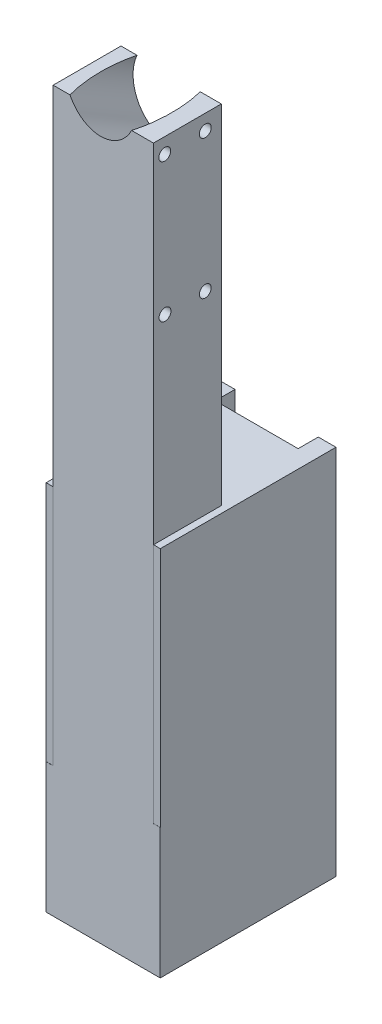
ISO-10303-21;
HEADER;
FILE_DESCRIPTION(('STEP AP214'),'2;1');
FILE_NAME('part.step','',(''),(''),'','','');
FILE_SCHEMA(('AUTOMOTIVE_DESIGN { 1 0 10303 214 1 1 1 1 }'));
ENDSEC;
DATA;
#1=APPLICATION_CONTEXT('core data for automotive mechanical design processes');
#2=APPLICATION_PROTOCOL_DEFINITION('international standard','automotive_design',2000,#1);
#3=PRODUCT_CONTEXT('',#1,'mechanical');
#4=PRODUCT('Part','Part','',(#3));
#5=PRODUCT_RELATED_PRODUCT_CATEGORY('part','',(#4));
#6=PRODUCT_DEFINITION_FORMATION('','',#4);
#7=PRODUCT_DEFINITION_CONTEXT('part definition',#1,'design');
#8=PRODUCT_DEFINITION('design','',#6,#7);
#9=PRODUCT_DEFINITION_SHAPE('','',#8);
#10=(LENGTH_UNIT() NAMED_UNIT(*) SI_UNIT(.MILLI.,.METRE.));
#11=(NAMED_UNIT(*) PLANE_ANGLE_UNIT() SI_UNIT($,.RADIAN.));
#12=(NAMED_UNIT(*) SI_UNIT($,.STERADIAN.) SOLID_ANGLE_UNIT());
#13=UNCERTAINTY_MEASURE_WITH_UNIT(LENGTH_MEASURE(1.E-05),#10,'distance_accuracy_value','');
#14=(GEOMETRIC_REPRESENTATION_CONTEXT(3) GLOBAL_UNCERTAINTY_ASSIGNED_CONTEXT((#13)) GLOBAL_UNIT_ASSIGNED_CONTEXT((#10,
#11,#12)) REPRESENTATION_CONTEXT('',''));
#15=CARTESIAN_POINT('',(0.,0.,0.));
#16=DIRECTION('',(0.,0.,1.));
#17=DIRECTION('',(1.,0.,0.));
#18=AXIS2_PLACEMENT_3D('',#15,#16,#17);
#19=CARTESIAN_POINT('',(4691.55444195582,-4349.73956554871,53.2520183883639));
#20=DIRECTION('',(-1.,0.,0.));
#21=DIRECTION('',(0.,1.,0.));
#22=AXIS2_PLACEMENT_3D('',#19,#20,#21);
#23=PLANE('',#22);
#24=CARTESIAN_POINT('',(4691.55444195582,-4349.73956554871,53.2520183883639));
#25=DIRECTION('',(1.,0.,0.));
#26=DIRECTION('',(0.,1.,0.));
#27=AXIS2_PLACEMENT_3D('',#24,#25,#26);
#28=CIRCLE('',#27,1.50000000000031);
#29=CARTESIAN_POINT('',(4691.55444195582,-4348.23956554871,53.2520183883639));
#30=VERTEX_POINT('',#29);
#31=EDGE_CURVE('E277',#30,#30,#28,.T.);
#32=ORIENTED_EDGE('',*,*,#31,.F.);
#33=EDGE_LOOP('',(#32));
#34=FACE_BOUND('',#33,.T.);
#35=ADVANCED_FACE('F35',(#34),#23,.T.);
#36=CARTESIAN_POINT('',(4691.55444195582,-4349.73956554871,43.0468273602777));
#37=DIRECTION('',(-1.,0.,0.));
#38=DIRECTION('',(0.,1.,0.));
#39=AXIS2_PLACEMENT_3D('',#36,#37,#38);
#40=PLANE('',#39);
#41=CARTESIAN_POINT('',(4691.55444195582,-4349.73956554871,43.0468273602777));
#42=DIRECTION('',(1.,0.,0.));
#43=DIRECTION('',(0.,1.,0.));
#44=AXIS2_PLACEMENT_3D('',#41,#42,#43);
#45=CIRCLE('',#44,1.50000000000004);
#46=CARTESIAN_POINT('',(4691.55444195582,-4348.23956554871,43.0468273602777));
#47=VERTEX_POINT('',#46);
#48=EDGE_CURVE('E276',#47,#47,#45,.T.);
#49=ORIENTED_EDGE('',*,*,#48,.F.);
#50=EDGE_LOOP('',(#49));
#51=FACE_BOUND('',#50,.T.);
#52=ADVANCED_FACE('F688',(#51),#40,.T.);
#53=CARTESIAN_POINT('',(4696.55444195582,-4384.90256348358,53.2520183883639));
#54=DIRECTION('',(-1.,0.,0.));
#55=DIRECTION('',(0.,1.,0.));
#56=AXIS2_PLACEMENT_3D('',#53,#54,#55);
#57=PLANE('',#56);
#58=CARTESIAN_POINT('',(4696.55444195582,-4384.90256348358,53.2520183883639));
#59=DIRECTION('',(1.,0.,0.));
#60=DIRECTION('',(0.,1.,0.));
#61=AXIS2_PLACEMENT_3D('',#58,#59,#60);
#62=CIRCLE('',#61,1.49999999999993);
#63=CARTESIAN_POINT('',(4696.55444195582,-4383.40256348358,53.2520183883639));
#64=VERTEX_POINT('',#63);
#65=EDGE_CURVE('E297',#64,#64,#62,.T.);
#66=ORIENTED_EDGE('',*,*,#65,.F.);
#67=EDGE_LOOP('',(#66));
#68=FACE_BOUND('',#67,.T.);
#69=ADVANCED_FACE('F693',(#68),#57,.T.);
#70=CARTESIAN_POINT('',(4696.55444195582,-4384.90256348358,43.0468273602777));
#71=DIRECTION('',(-1.,0.,0.));
#72=DIRECTION('',(0.,1.,0.));
#73=AXIS2_PLACEMENT_3D('',#70,#71,#72);
#74=PLANE('',#73);
#75=CARTESIAN_POINT('',(4696.55444195582,-4384.90256348358,43.0468273602777));
#76=DIRECTION('',(1.,0.,0.));
#77=DIRECTION('',(0.,1.,0.));
#78=AXIS2_PLACEMENT_3D('',#75,#76,#77);
#79=CIRCLE('',#78,1.50000000000008);
#80=CARTESIAN_POINT('',(4696.55444195582,-4383.40256348358,43.0468273602777));
#81=VERTEX_POINT('',#80);
#82=EDGE_CURVE('E296',#81,#81,#79,.T.);
#83=ORIENTED_EDGE('',*,*,#82,.F.);
#84=EDGE_LOOP('',(#83));
#85=FACE_BOUND('',#84,.T.);
#86=ADVANCED_FACE('F715',(#85),#74,.T.);
#87=CARTESIAN_POINT('',(4710.95444195582,-4349.73956554871,53.3144563773744));
#88=DIRECTION('',(1.,0.,0.));
#89=DIRECTION('',(0.,-1.,0.));
#90=AXIS2_PLACEMENT_3D('',#87,#88,#89);
#91=PLANE('',#90);
#92=CARTESIAN_POINT('',(4710.95444195582,-4349.73956554871,53.3144563773744));
#93=DIRECTION('',(-1.,0.,0.));
#94=DIRECTION('',(0.,-1.,0.));
#95=AXIS2_PLACEMENT_3D('',#92,#93,#94);
#96=CIRCLE('',#95,1.49999999999987);
#97=CARTESIAN_POINT('',(4710.95444195582,-4351.23956554871,53.3144563773744));
#98=VERTEX_POINT('',#97);
#99=EDGE_CURVE('E283',#98,#98,#96,.T.);
#100=ORIENTED_EDGE('',*,*,#99,.F.);
#101=EDGE_LOOP('',(#100));
#102=FACE_BOUND('',#101,.T.);
#103=ADVANCED_FACE('F709',(#102),#91,.T.);
#104=CARTESIAN_POINT('',(4710.95444195582,-4349.73956554871,43.0468273602777));
#105=DIRECTION('',(1.,0.,0.));
#106=DIRECTION('',(0.,-1.,0.));
#107=AXIS2_PLACEMENT_3D('',#104,#105,#106);
#108=PLANE('',#107);
#109=CARTESIAN_POINT('',(4710.95444195582,-4349.73956554871,43.0468273602777));
#110=DIRECTION('',(-1.,0.,0.));
#111=DIRECTION('',(0.,-1.,0.));
#112=AXIS2_PLACEMENT_3D('',#109,#110,#111);
#113=CIRCLE('',#112,1.50000000000009);
#114=CARTESIAN_POINT('',(4710.95444195582,-4351.23956554871,43.0468273602777));
#115=VERTEX_POINT('',#114);
#116=EDGE_CURVE('E287',#115,#115,#113,.T.);
#117=ORIENTED_EDGE('',*,*,#116,.F.);
#118=EDGE_LOOP('',(#117));
#119=FACE_BOUND('',#118,.T.);
#120=ADVANCED_FACE('F714',(#119),#108,.T.);
#121=CARTESIAN_POINT('',(4705.95444195582,-4384.90256348358,43.0468273602777));
#122=DIRECTION('',(1.,0.,0.));
#123=DIRECTION('',(0.,-1.,0.));
#124=AXIS2_PLACEMENT_3D('',#121,#122,#123);
#125=PLANE('',#124);
#126=CARTESIAN_POINT('',(4705.95444195582,-4384.90256348358,43.0468273602777));
#127=DIRECTION('',(-1.,0.,0.));
#128=DIRECTION('',(0.,-1.,0.));
#129=AXIS2_PLACEMENT_3D('',#126,#127,#128);
#130=CIRCLE('',#129,1.50000000000002);
#131=CARTESIAN_POINT('',(4705.95444195582,-4386.40256348358,43.0468273602777));
#132=VERTEX_POINT('',#131);
#133=EDGE_CURVE('E303',#132,#132,#130,.T.);
#134=ORIENTED_EDGE('',*,*,#133,.F.);
#135=EDGE_LOOP('',(#134));
#136=FACE_BOUND('',#135,.T.);
#137=ADVANCED_FACE('F736',(#136),#125,.T.);
#138=CARTESIAN_POINT('',(4705.95444195582,-4384.90256348358,53.2520183883639));
#139=DIRECTION('',(1.,0.,0.));
#140=DIRECTION('',(0.,-1.,0.));
#141=AXIS2_PLACEMENT_3D('',#138,#139,#140);
#142=PLANE('',#141);
#143=CARTESIAN_POINT('',(4705.95444195582,-4384.90256348358,53.2520183883639));
#144=DIRECTION('',(-1.,0.,0.));
#145=DIRECTION('',(0.,-1.,0.));
#146=AXIS2_PLACEMENT_3D('',#143,#144,#145);
#147=CIRCLE('',#146,1.49999999999989);
#148=CARTESIAN_POINT('',(4705.95444195582,-4386.40256348358,53.2520183883639));
#149=VERTEX_POINT('',#148);
#150=EDGE_CURVE('E307',#149,#149,#147,.T.);
#151=ORIENTED_EDGE('',*,*,#150,.F.);
#152=EDGE_LOOP('',(#151));
#153=FACE_BOUND('',#152,.T.);
#154=ADVANCED_FACE('F547',(#153),#142,.T.);
#155=CARTESIAN_POINT('',(4701.20818872367,-4491.71721595928,21.7710006429915));
#156=DIRECTION('',(0.,0.,-1.));
#157=DIRECTION('',(0.,1.,0.));
#158=AXIS2_PLACEMENT_3D('',#155,#156,#157);
#159=PLANE('',#158);
#160=CARTESIAN_POINT('',(4701.20818872367,-4491.71721595928,21.7710006429915));
#161=DIRECTION('',(0.,0.,-1.));
#162=DIRECTION('',(0.,1.,0.));
#163=AXIS2_PLACEMENT_3D('',#160,#161,#162);
#164=CIRCLE('',#163,1.40000000000023);
#165=CARTESIAN_POINT('',(4701.20818872367,-4490.31721595928,21.7710006429915));
#166=VERTEX_POINT('',#165);
#167=EDGE_CURVE('E347',#166,#166,#164,.T.);
#168=ORIENTED_EDGE('',*,*,#167,.T.);
#169=EDGE_LOOP('',(#168));
#170=FACE_BOUND('',#169,.T.);
#171=ADVANCED_FACE('F539',(#170),#159,.T.);
#172=CARTESIAN_POINT('',(4701.20818872367,-4445.91721595928,21.7710006429915));
#173=DIRECTION('',(0.,0.,-1.));
#174=DIRECTION('',(0.,1.,0.));
#175=AXIS2_PLACEMENT_3D('',#172,#173,#174);
#176=PLANE('',#175);
#177=CARTESIAN_POINT('',(4701.20818872367,-4445.91721595928,21.7710006429915));
#178=DIRECTION('',(0.,0.,-1.));
#179=DIRECTION('',(0.,1.,0.));
#180=AXIS2_PLACEMENT_3D('',#177,#178,#179);
#181=CIRCLE('',#180,1.40000000000023);
#182=CARTESIAN_POINT('',(4701.20818872367,-4444.51721595928,21.7710006429915));
#183=VERTEX_POINT('',#182);
#184=EDGE_CURVE('E341',#183,#183,#181,.T.);
#185=ORIENTED_EDGE('',*,*,#184,.T.);
#186=EDGE_LOOP('',(#185));
#187=FACE_BOUND('',#186,.T.);
#188=ADVANCED_FACE('F535',(#187),#176,.T.);
#189=CARTESIAN_POINT('',(4691.55444195582,-4349.73956554871,53.2520183883639));
#190=DIRECTION('',(-1.,0.,0.));
#191=DIRECTION('',(0.,-1.,0.));
#192=AXIS2_PLACEMENT_3D('',#189,#190,#191);
#193=CYLINDRICAL_SURFACE('',#192,1.50000000000031);
#194=ORIENTED_EDGE('',*,*,#31,.T.);
#195=EDGE_LOOP('',(#194));
#196=FACE_BOUND('',#195,.T.);
#197=CARTESIAN_POINT('',(4689.15444195568,-4349.73956554871,53.2520183883639));
#198=DIRECTION('',(1.,0.,0.));
#199=DIRECTION('',(0.,1.,0.));
#200=AXIS2_PLACEMENT_3D('',#197,#198,#199);
#201=CIRCLE('',#200,1.50000000000031);
#202=CARTESIAN_POINT('',(4689.15444195568,-4348.23956554871,53.2520183883639));
#203=VERTEX_POINT('',#202);
#204=EDGE_CURVE('E290',#203,#203,#201,.F.);
#205=ORIENTED_EDGE('',*,*,#204,.T.);
#206=EDGE_LOOP('',(#205));
#207=FACE_BOUND('',#206,.T.);
#208=ADVANCED_FACE('F538',(#196,#207),#193,.F.);
#209=CARTESIAN_POINT('',(4691.55444195582,-4349.73956554871,43.0468273602777));
#210=DIRECTION('',(-1.,0.,0.));
#211=DIRECTION('',(0.,-1.,0.));
#212=AXIS2_PLACEMENT_3D('',#209,#210,#211);
#213=CYLINDRICAL_SURFACE('',#212,1.50000000000004);
#214=ORIENTED_EDGE('',*,*,#48,.T.);
#215=EDGE_LOOP('',(#214));
#216=FACE_BOUND('',#215,.T.);
#217=CARTESIAN_POINT('',(4689.15444195568,-4349.73956554871,43.0468273602777));
#218=DIRECTION('',(1.,0.,0.));
#219=DIRECTION('',(0.,1.,0.));
#220=AXIS2_PLACEMENT_3D('',#217,#218,#219);
#221=CIRCLE('',#220,1.50000000000004);
#222=CARTESIAN_POINT('',(4689.15444195568,-4348.23956554871,43.0468273602777));
#223=VERTEX_POINT('',#222);
#224=EDGE_CURVE('E280',#223,#223,#221,.F.);
#225=ORIENTED_EDGE('',*,*,#224,.T.);
#226=EDGE_LOOP('',(#225));
#227=FACE_BOUND('',#226,.T.);
#228=ADVANCED_FACE('F681',(#216,#227),#213,.F.);
#229=CARTESIAN_POINT('',(4673.55444195582,-4384.90256348358,53.2520183883639));
#230=DIRECTION('',(1.,0.,0.));
#231=DIRECTION('',(0.,1.,0.));
#232=AXIS2_PLACEMENT_3D('',#229,#230,#231);
#233=CYLINDRICAL_SURFACE('',#232,1.49999999999993);
#234=ORIENTED_EDGE('',*,*,#65,.T.);
#235=EDGE_LOOP('',(#234));
#236=FACE_BOUND('',#235,.T.);
#237=CARTESIAN_POINT('',(4689.15444195568,-4384.90256348358,53.2520183883639));
#238=DIRECTION('',(1.,0.,0.));
#239=DIRECTION('',(0.,1.,0.));
#240=AXIS2_PLACEMENT_3D('',#237,#238,#239);
#241=CIRCLE('',#240,1.49999999999993);
#242=CARTESIAN_POINT('',(4689.15444195568,-4383.40256348358,53.2520183883639));
#243=VERTEX_POINT('',#242);
#244=EDGE_CURVE('E310',#243,#243,#241,.T.);
#245=ORIENTED_EDGE('',*,*,#244,.F.);
#246=EDGE_LOOP('',(#245));
#247=FACE_BOUND('',#246,.T.);
#248=ADVANCED_FACE('F703',(#236,#247),#233,.F.);
#249=CARTESIAN_POINT('',(4673.55444195582,-4384.90256348358,43.0468273602777));
#250=DIRECTION('',(1.,0.,0.));
#251=DIRECTION('',(0.,1.,0.));
#252=AXIS2_PLACEMENT_3D('',#249,#250,#251);
#253=CYLINDRICAL_SURFACE('',#252,1.50000000000008);
#254=ORIENTED_EDGE('',*,*,#82,.T.);
#255=EDGE_LOOP('',(#254));
#256=FACE_BOUND('',#255,.T.);
#257=CARTESIAN_POINT('',(4689.15444195568,-4384.90256348358,43.0468273602777));
#258=DIRECTION('',(1.,0.,0.));
#259=DIRECTION('',(0.,1.,0.));
#260=AXIS2_PLACEMENT_3D('',#257,#258,#259);
#261=CIRCLE('',#260,1.50000000000008);
#262=CARTESIAN_POINT('',(4689.15444195568,-4383.40256348358,43.0468273602777));
#263=VERTEX_POINT('',#262);
#264=EDGE_CURVE('E300',#263,#263,#261,.T.);
#265=ORIENTED_EDGE('',*,*,#264,.F.);
#266=EDGE_LOOP('',(#265));
#267=FACE_BOUND('',#266,.T.);
#268=ADVANCED_FACE('F534',(#256,#267),#253,.F.);
#269=CARTESIAN_POINT('',(4714.55444195569,-4315.19321890237,39.0000000000001));
#270=DIRECTION('',(0.,0.,1.));
#271=DIRECTION('',(0.,-1.,0.));
#272=AXIS2_PLACEMENT_3D('',#269,#270,#271);
#273=PLANE('',#272);
#274=CARTESIAN_POINT('',(4701.21390972028,-4350.59250283977,39.0000000000001));
#275=DIRECTION('',(0.,0.,1.));
#276=DIRECTION('',(0.,1.,0.));
#277=AXIS2_PLACEMENT_3D('',#274,#275,#276);
#278=ELLIPSE('',#277,10.3923048454137,9.00000000000035);
#279=CARTESIAN_POINT('',(4709.22570229872,-4345.85806451614,39.0000000000001));
#280=VERTEX_POINT('',#279);
#281=CARTESIAN_POINT('',(4693.20211714185,-4345.85806451614,39.0000000000001));
#282=VERTEX_POINT('',#281);
#283=EDGE_CURVE('E291',#280,#282,#278,.F.);
#284=ORIENTED_EDGE('',*,*,#283,.F.);
#285=DIRECTION('',(1.,0.,0.));
#286=VECTOR('',#285,1.);
#287=CARTESIAN_POINT('',(4714.55444195569,-4345.85806451614,39.0000000000001));
#288=LINE('',#287,#286);
#289=CARTESIAN_POINT('',(4714.55444195569,-4345.85806451614,39.));
#290=VERTEX_POINT('',#289);
#291=EDGE_CURVE('E318',#280,#290,#288,.T.);
#292=ORIENTED_EDGE('',*,*,#291,.T.);
#293=DIRECTION('',(0.,-1.,0.));
#294=VECTOR('',#293,1.);
#295=CARTESIAN_POINT('',(4714.55444195569,-4315.19321890237,39.0000000000001));
#296=LINE('',#295,#294);
#297=CARTESIAN_POINT('',(4714.55444195569,-4433.96840812318,39.));
#298=VERTEX_POINT('',#297);
#299=EDGE_CURVE('E323',#290,#298,#296,.T.);
#300=ORIENTED_EDGE('',*,*,#299,.T.);
#301=DIRECTION('',(1.,0.,0.));
#302=VECTOR('',#301,1.);
#303=CARTESIAN_POINT('',(0.,-4433.96840812318,39.));
#304=LINE('',#303,#302);
#305=CARTESIAN_POINT('',(4689.15444195568,-4433.96840812318,39.));
#306=VERTEX_POINT('',#305);
#307=EDGE_CURVE('E400',#306,#298,#304,.T.);
#308=ORIENTED_EDGE('',*,*,#307,.F.);
#309=DIRECTION('',(0.,-1.,0.));
#310=VECTOR('',#309,1.);
#311=CARTESIAN_POINT('',(4689.15444195568,-4315.19321890237,39.0000000000001));
#312=LINE('',#311,#310);
#313=CARTESIAN_POINT('',(4689.15444195568,-4345.85806451614,39.));
#314=VERTEX_POINT('',#313);
#315=EDGE_CURVE('E331',#314,#306,#312,.T.);
#316=ORIENTED_EDGE('',*,*,#315,.F.);
#317=EDGE_CURVE('E319',#314,#282,#288,.T.);
#318=ORIENTED_EDGE('',*,*,#317,.T.);
#319=EDGE_LOOP('',(#284,#292,#300,#308,#316,#318));
#320=FACE_BOUND('',#319,.T.);
#321=ADVANCED_FACE('F439',(#320),#273,.F.);
#322=CARTESIAN_POINT('',(4716.95444195582,-4349.73956554871,53.3144563773744));
#323=DIRECTION('',(-1.,0.,0.));
#324=DIRECTION('',(0.,-1.,0.));
#325=AXIS2_PLACEMENT_3D('',#322,#323,#324);
#326=CYLINDRICAL_SURFACE('',#325,1.49999999999987);
#327=ORIENTED_EDGE('',*,*,#99,.T.);
#328=EDGE_LOOP('',(#327));
#329=FACE_BOUND('',#328,.T.);
#330=CARTESIAN_POINT('',(4714.55444195569,-4349.73956554871,53.3144563773744));
#331=DIRECTION('',(-1.,0.,0.));
#332=DIRECTION('',(0.,-1.,0.));
#333=AXIS2_PLACEMENT_3D('',#330,#331,#332);
#334=CIRCLE('',#333,1.49999999999987);
#335=CARTESIAN_POINT('',(4714.55444195569,-4351.23956554871,53.3144563773744));
#336=VERTEX_POINT('',#335);
#337=EDGE_CURVE('E294',#336,#336,#334,.T.);
#338=ORIENTED_EDGE('',*,*,#337,.F.);
#339=EDGE_LOOP('',(#338));
#340=FACE_BOUND('',#339,.T.);
#341=ADVANCED_FACE('F533',(#329,#340),#326,.F.);
#342=CARTESIAN_POINT('',(4716.95444195582,-4349.73956554871,43.0468273602777));
#343=DIRECTION('',(-1.,0.,0.));
#344=DIRECTION('',(0.,-1.,0.));
#345=AXIS2_PLACEMENT_3D('',#342,#343,#344);
#346=CYLINDRICAL_SURFACE('',#345,1.50000000000009);
#347=ORIENTED_EDGE('',*,*,#116,.T.);
#348=EDGE_LOOP('',(#347));
#349=FACE_BOUND('',#348,.T.);
#350=CARTESIAN_POINT('',(4714.55444195569,-4349.73956554871,43.0468273602777));
#351=DIRECTION('',(-1.,0.,0.));
#352=DIRECTION('',(0.,-1.,0.));
#353=AXIS2_PLACEMENT_3D('',#350,#351,#352);
#354=CIRCLE('',#353,1.50000000000009);
#355=CARTESIAN_POINT('',(4714.55444195569,-4351.23956554871,43.0468273602777));
#356=VERTEX_POINT('',#355);
#357=EDGE_CURVE('E286',#356,#356,#354,.T.);
#358=ORIENTED_EDGE('',*,*,#357,.F.);
#359=EDGE_LOOP('',(#358));
#360=FACE_BOUND('',#359,.T.);
#361=ADVANCED_FACE('F726',(#349,#360),#346,.F.);
#362=CARTESIAN_POINT('',(4731.64888795786,-4384.90256348358,43.0468273602777));
#363=DIRECTION('',(-1.,0.,0.));
#364=DIRECTION('',(0.,-1.,0.));
#365=AXIS2_PLACEMENT_3D('',#362,#363,#364);
#366=CYLINDRICAL_SURFACE('',#365,1.50000000000002);
#367=ORIENTED_EDGE('',*,*,#133,.T.);
#368=EDGE_LOOP('',(#367));
#369=FACE_BOUND('',#368,.T.);
#370=CARTESIAN_POINT('',(4714.55444195569,-4384.90256348358,43.0468273602777));
#371=DIRECTION('',(-1.,0.,0.));
#372=DIRECTION('',(0.,-1.,0.));
#373=AXIS2_PLACEMENT_3D('',#370,#371,#372);
#374=CIRCLE('',#373,1.50000000000002);
#375=CARTESIAN_POINT('',(4714.55444195569,-4386.40256348358,43.0468273602777));
#376=VERTEX_POINT('',#375);
#377=EDGE_CURVE('E326',#376,#376,#374,.T.);
#378=ORIENTED_EDGE('',*,*,#377,.F.);
#379=EDGE_LOOP('',(#378));
#380=FACE_BOUND('',#379,.T.);
#381=ADVANCED_FACE('F745',(#369,#380),#366,.F.);
#382=CARTESIAN_POINT('',(4731.64888795786,-4384.90256348358,53.2520183883639));
#383=DIRECTION('',(-1.,0.,0.));
#384=DIRECTION('',(0.,-1.,0.));
#385=AXIS2_PLACEMENT_3D('',#382,#383,#384);
#386=CYLINDRICAL_SURFACE('',#385,1.49999999999989);
#387=ORIENTED_EDGE('',*,*,#150,.T.);
#388=EDGE_LOOP('',(#387));
#389=FACE_BOUND('',#388,.T.);
#390=CARTESIAN_POINT('',(4714.55444195569,-4384.90256348358,53.2520183883639));
#391=DIRECTION('',(-1.,0.,0.));
#392=DIRECTION('',(0.,-1.,0.));
#393=AXIS2_PLACEMENT_3D('',#390,#391,#392);
#394=CIRCLE('',#393,1.49999999999989);
#395=CARTESIAN_POINT('',(4714.55444195569,-4386.40256348358,53.2520183883639));
#396=VERTEX_POINT('',#395);
#397=EDGE_CURVE('E306',#396,#396,#394,.T.);
#398=ORIENTED_EDGE('',*,*,#397,.F.);
#399=EDGE_LOOP('',(#398));
#400=FACE_BOUND('',#399,.T.);
#401=ADVANCED_FACE('F556',(#389,#400),#386,.F.);
#402=CARTESIAN_POINT('',(4709.80818871422,-4433.96840812318,56.1600064391854));
#403=DIRECTION('',(0.,0.,-1.));
#404=DIRECTION('',(0.,1.,0.));
#405=AXIS2_PLACEMENT_3D('',#402,#403,#404);
#406=PLANE('',#405);
#407=DIRECTION('',(1.,0.,0.));
#408=VECTOR('',#407,1.);
#409=CARTESIAN_POINT('',(4687.34687520891,-4495.12840812318,56.1600064391854));
#410=LINE('',#409,#408);
#411=CARTESIAN_POINT('',(4714.55444195569,-4495.12840812318,56.1600064391853));
#412=VERTEX_POINT('',#411);
#413=CARTESIAN_POINT('',(4716.26950221952,-4495.12840812318,56.1600064391853));
#414=VERTEX_POINT('',#413);
#415=EDGE_CURVE('E252',#412,#414,#410,.T.);
#416=ORIENTED_EDGE('',*,*,#415,.T.);
#417=DIRECTION('',(0.,-1.,0.));
#418=VECTOR('',#417,1.);
#419=CARTESIAN_POINT('',(4716.26950221952,-4433.96840812318,56.1600064391854));
#420=LINE('',#419,#418);
#421=CARTESIAN_POINT('',(4716.26950221952,-4433.96840812318,56.1600064391854));
#422=VERTEX_POINT('',#421);
#423=EDGE_CURVE('E397',#422,#414,#420,.T.);
#424=ORIENTED_EDGE('',*,*,#423,.F.);
#425=DIRECTION('',(1.,0.,0.));
#426=VECTOR('',#425,1.);
#427=CARTESIAN_POINT('',(4709.80818871422,-4433.96840812318,56.1600064391854));
#428=LINE('',#427,#426);
#429=CARTESIAN_POINT('',(4714.55444195569,-4433.96840812318,56.1600064391854));
#430=VERTEX_POINT('',#429);
#431=EDGE_CURVE('E357',#430,#422,#428,.T.);
#432=ORIENTED_EDGE('',*,*,#431,.F.);
#433=DIRECTION('',(0.,1.,0.));
#434=VECTOR('',#433,1.);
#435=CARTESIAN_POINT('',(4714.55444195569,-4433.96840812318,56.1600064391854));
#436=LINE('',#435,#434);
#437=EDGE_CURVE('E338',#412,#430,#436,.T.);
#438=ORIENTED_EDGE('',*,*,#437,.F.);
#439=EDGE_LOOP('',(#416,#424,#432,#438));
#440=FACE_BOUND('',#439,.T.);
#441=ADVANCED_FACE('F477',(#440),#406,.F.);
#442=CARTESIAN_POINT('',(4709.80818871422,-4433.96840812318,11.6703669037885));
#443=DIRECTION('',(0.,0.,1.));
#444=DIRECTION('',(0.,-1.,0.));
#445=AXIS2_PLACEMENT_3D('',#442,#443,#444);
#446=PLANE('',#445);
#447=DIRECTION('',(0.,-1.,0.));
#448=VECTOR('',#447,1.);
#449=CARTESIAN_POINT('',(4709.80818871422,-4433.96840812318,11.6703669037885));
#450=LINE('',#449,#448);
#451=CARTESIAN_POINT('',(4709.80818871422,-4505.75880094356,11.6703669037885));
#452=VERTEX_POINT('',#451);
#453=CARTESIAN_POINT('',(4709.80818871422,-4525.12840812318,11.6703669037885));
#454=VERTEX_POINT('',#453);
#455=EDGE_CURVE('E393',#452,#454,#450,.T.);
#456=ORIENTED_EDGE('',*,*,#455,.F.);
#457=DIRECTION('',(-1.,0.,0.));
#458=VECTOR('',#457,1.);
#459=CARTESIAN_POINT('',(4711.78575008067,-4505.75880094356,11.6703669037885));
#460=LINE('',#459,#458);
#461=CARTESIAN_POINT('',(4711.78575008067,-4505.75880094356,11.6703669037885));
#462=VERTEX_POINT('',#461);
#463=EDGE_CURVE('E50',#462,#452,#460,.T.);
#464=ORIENTED_EDGE('',*,*,#463,.F.);
#465=DIRECTION('',(0.,-1.,0.));
#466=VECTOR('',#465,1.);
#467=CARTESIAN_POINT('',(4711.78575008067,-4433.96840812318,11.6703669037885));
#468=LINE('',#467,#466);
#469=CARTESIAN_POINT('',(4711.78575008067,-4433.96840812318,11.6703669037885));
#470=VERTEX_POINT('',#469);
#471=EDGE_CURVE('E220',#470,#462,#468,.T.);
#472=ORIENTED_EDGE('',*,*,#471,.F.);
#473=DIRECTION('',(-1.,0.,0.));
#474=VECTOR('',#473,1.);
#475=CARTESIAN_POINT('',(4709.80818871422,-4433.96840812318,11.6703669037885));
#476=LINE('',#475,#474);
#477=CARTESIAN_POINT('',(4716.26950221952,-4433.96840812318,11.6703669037885));
#478=VERTEX_POINT('',#477);
#479=EDGE_CURVE('E359',#478,#470,#476,.T.);
#480=ORIENTED_EDGE('',*,*,#479,.F.);
#481=DIRECTION('',(0.,-1.,0.));
#482=VECTOR('',#481,1.);
#483=CARTESIAN_POINT('',(4716.26950221952,-4433.96840812318,11.6703669037885));
#484=LINE('',#483,#482);
#485=CARTESIAN_POINT('',(4716.26950221952,-4528.12840812318,11.6703669037885));
#486=VERTEX_POINT('',#485);
#487=EDGE_CURVE('E200',#478,#486,#484,.T.);
#488=ORIENTED_EDGE('',*,*,#487,.T.);
#489=DIRECTION('',(1.,0.,0.));
#490=VECTOR('',#489,1.);
#491=CARTESIAN_POINT('',(4687.34687520891,-4528.12840812318,11.6703669037885));
#492=LINE('',#491,#490);
#493=CARTESIAN_POINT('',(4687.34687520891,-4528.12840812318,11.6703669037885));
#494=VERTEX_POINT('',#493);
#495=EDGE_CURVE('E191',#494,#486,#492,.T.);
#496=ORIENTED_EDGE('',*,*,#495,.F.);
#497=DIRECTION('',(0.,1.,0.));
#498=VECTOR('',#497,1.);
#499=CARTESIAN_POINT('',(4687.34687520891,-4528.12840812318,11.6703669037885));
#500=LINE('',#499,#498);
#501=CARTESIAN_POINT('',(4687.34687520891,-4525.12840812318,11.6703669037885));
#502=VERTEX_POINT('',#501);
#503=EDGE_CURVE('E197',#494,#502,#500,.T.);
#504=ORIENTED_EDGE('',*,*,#503,.T.);
#505=DIRECTION('',(1.,0.,0.));
#506=VECTOR('',#505,1.);
#507=CARTESIAN_POINT('',(4687.34687520891,-4525.12840812318,11.6703669037885));
#508=LINE('',#507,#506);
#509=EDGE_CURVE('E214',#502,#454,#508,.T.);
#510=ORIENTED_EDGE('',*,*,#509,.T.);
#511=EDGE_LOOP('',(#456,#464,#472,#480,#488,#496,#504,#510));
#512=FACE_BOUND('',#511,.T.);
#513=ADVANCED_FACE('F194',(#512),#446,.F.);
#514=CARTESIAN_POINT('',(4701.20818872367,-4491.71721595928,21.7710006429915));
#515=DIRECTION('',(0.,0.,-1.));
#516=DIRECTION('',(0.,1.,0.));
#517=AXIS2_PLACEMENT_3D('',#514,#515,#516);
#518=CYLINDRICAL_SURFACE('',#517,1.40000000000023);
#519=ORIENTED_EDGE('',*,*,#167,.F.);
#520=EDGE_LOOP('',(#519));
#521=FACE_BOUND('',#520,.T.);
#522=CARTESIAN_POINT('',(4701.20818872367,-4491.71721595928,16.7710006429915));
#523=DIRECTION('',(0.,0.,-1.));
#524=DIRECTION('',(0.,1.,0.));
#525=AXIS2_PLACEMENT_3D('',#522,#523,#524);
#526=CIRCLE('',#525,1.40000000000023);
#527=CARTESIAN_POINT('',(4701.20818872367,-4490.31721595928,16.7710006429915));
#528=VERTEX_POINT('',#527);
#529=EDGE_CURVE('E344',#528,#528,#526,.T.);
#530=ORIENTED_EDGE('',*,*,#529,.T.);
#531=EDGE_LOOP('',(#530));
#532=FACE_BOUND('',#531,.T.);
#533=ADVANCED_FACE('F543',(#521,#532),#518,.F.);
#534=CARTESIAN_POINT('',(4701.20818872367,-4445.91721595928,21.7710006429915));
#535=DIRECTION('',(0.,0.,-1.));
#536=DIRECTION('',(0.,1.,0.));
#537=AXIS2_PLACEMENT_3D('',#534,#535,#536);
#538=CYLINDRICAL_SURFACE('',#537,1.40000000000023);
#539=ORIENTED_EDGE('',*,*,#184,.F.);
#540=EDGE_LOOP('',(#539));
#541=FACE_BOUND('',#540,.T.);
#542=CARTESIAN_POINT('',(4701.20818872367,-4445.91721595928,16.7710006429915));
#543=DIRECTION('',(0.,0.,-1.));
#544=DIRECTION('',(0.,1.,0.));
#545=AXIS2_PLACEMENT_3D('',#542,#543,#544);
#546=CIRCLE('',#545,1.40000000000023);
#547=CARTESIAN_POINT('',(4701.20818872367,-4444.51721595928,16.7710006429915));
#548=VERTEX_POINT('',#547);
#549=EDGE_CURVE('E340',#548,#548,#546,.T.);
#550=ORIENTED_EDGE('',*,*,#549,.T.);
#551=EDGE_LOOP('',(#550));
#552=FACE_BOUND('',#551,.T.);
#553=ADVANCED_FACE('F512',(#541,#552),#538,.F.);
#554=CARTESIAN_POINT('',(4709.80818871422,-4433.96840812318,16.7710006429915));
#555=DIRECTION('',(1.,0.,1.21891695342006E-12));
#556=DIRECTION('',(1.21891695342006E-12,0.,-1.));
#557=AXIS2_PLACEMENT_3D('',#554,#555,#556);
#558=PLANE('',#557);
#559=DIRECTION('',(0.,-1.,0.));
#560=VECTOR('',#559,1.);
#561=CARTESIAN_POINT('',(4709.80818871422,-4433.96840812318,16.7710006429915));
#562=LINE('',#561,#560);
#563=CARTESIAN_POINT('',(4709.80818871422,-4505.75880094356,16.7710006429915));
#564=VERTEX_POINT('',#563);
#565=CARTESIAN_POINT('',(4709.80818871422,-4525.12840812318,16.7710006429915));
#566=VERTEX_POINT('',#565);
#567=EDGE_CURVE('E390',#564,#566,#562,.T.);
#568=ORIENTED_EDGE('',*,*,#567,.F.);
#569=DIRECTION('',(1.21891695342006E-12,0.,-1.));
#570=VECTOR('',#569,1.);
#571=CARTESIAN_POINT('',(4709.80818871422,-4505.75880094356,16.7710006429915));
#572=LINE('',#571,#570);
#573=EDGE_CURVE('E250',#564,#452,#572,.T.);
#574=ORIENTED_EDGE('',*,*,#573,.T.);
#575=ORIENTED_EDGE('',*,*,#455,.T.);
#576=DIRECTION('',(-1.21891695342006E-12,0.,1.));
#577=VECTOR('',#576,1.);
#578=CARTESIAN_POINT('',(4709.80818871422,-4525.12840812318,16.7710006429915));
#579=LINE('',#578,#577);
#580=EDGE_CURVE('E350',#454,#566,#579,.T.);
#581=ORIENTED_EDGE('',*,*,#580,.T.);
#582=EDGE_LOOP('',(#568,#574,#575,#581));
#583=FACE_BOUND('',#582,.T.);
#584=ADVANCED_FACE('F503',(#583),#558,.F.);
#585=CARTESIAN_POINT('',(4711.78575008067,-4505.75880094356,91.5674320392537));
#586=DIRECTION('',(0.,-1.,0.));
#587=DIRECTION('',(0.,0.,-1.));
#588=AXIS2_PLACEMENT_3D('',#585,#586,#587);
#589=PLANE('',#588);
#590=DIRECTION('',(-1.,0.,0.));
#591=VECTOR('',#590,1.);
#592=CARTESIAN_POINT('',(4711.78575008067,-4505.75880094356,16.7710006429915));
#593=LINE('',#592,#591);
#594=CARTESIAN_POINT('',(4711.78575008067,-4505.75880094356,16.7710006429915));
#595=VERTEX_POINT('',#594);
#596=EDGE_CURVE('E230',#595,#564,#593,.T.);
#597=ORIENTED_EDGE('',*,*,#596,.F.);
#598=DIRECTION('',(0.,0.,-1.));
#599=VECTOR('',#598,1.);
#600=CARTESIAN_POINT('',(4711.78575008067,-4505.75880094356,91.5674320392537));
#601=LINE('',#600,#599);
#602=EDGE_CURVE('E236',#595,#462,#601,.T.);
#603=ORIENTED_EDGE('',*,*,#602,.T.);
#604=ORIENTED_EDGE('',*,*,#463,.T.);
#605=ORIENTED_EDGE('',*,*,#573,.F.);
#606=EDGE_LOOP('',(#597,#603,#604,#605));
#607=FACE_BOUND('',#606,.T.);
#608=ADVANCED_FACE('F504',(#607),#589,.F.);
#609=CARTESIAN_POINT('',(4711.78575008067,-4433.96840812318,91.5674320392537));
#610=DIRECTION('',(1.,0.,0.));
#611=DIRECTION('',(0.,0.,-1.));
#612=AXIS2_PLACEMENT_3D('',#609,#610,#611);
#613=PLANE('',#612);
#614=DIRECTION('',(0.,0.,-1.));
#615=VECTOR('',#614,1.);
#616=CARTESIAN_POINT('',(4711.78575008067,-4433.96840812318,91.5674320392537));
#617=LINE('',#616,#615);
#618=CARTESIAN_POINT('',(4711.78575008067,-4433.96840812318,16.7710006429915));
#619=VERTEX_POINT('',#618);
#620=EDGE_CURVE('E237',#619,#470,#617,.T.);
#621=ORIENTED_EDGE('',*,*,#620,.T.);
#622=ORIENTED_EDGE('',*,*,#471,.T.);
#623=ORIENTED_EDGE('',*,*,#602,.F.);
#624=DIRECTION('',(0.,-1.,0.));
#625=VECTOR('',#624,1.);
#626=CARTESIAN_POINT('',(4711.78575008067,-4433.96840812318,16.7710006429915));
#627=LINE('',#626,#625);
#628=EDGE_CURVE('E233',#619,#595,#627,.T.);
#629=ORIENTED_EDGE('',*,*,#628,.F.);
#630=EDGE_LOOP('',(#621,#622,#623,#629));
#631=FACE_BOUND('',#630,.T.);
#632=ADVANCED_FACE('F483',(#631),#613,.F.);
#633=CARTESIAN_POINT('',(4709.80818871422,-4433.96840812318,16.7710006429915));
#634=DIRECTION('',(0.,0.,1.));
#635=DIRECTION('',(0.,-1.,0.));
#636=AXIS2_PLACEMENT_3D('',#633,#634,#635);
#637=PLANE('',#636);
#638=DIRECTION('',(0.,-1.,0.));
#639=VECTOR('',#638,1.);
#640=CARTESIAN_POINT('',(4693.80818871422,-4433.96840812318,16.7710006429915));
#641=LINE('',#640,#639);
#642=CARTESIAN_POINT('',(4693.80818871422,-4505.75880094356,16.7710006429915));
#643=VERTEX_POINT('',#642);
#644=CARTESIAN_POINT('',(4693.80818871422,-4525.12840812318,16.7710006429915));
#645=VERTEX_POINT('',#644);
#646=EDGE_CURVE('E387',#643,#645,#641,.T.);
#647=ORIENTED_EDGE('',*,*,#646,.F.);
#648=CARTESIAN_POINT('',(4690.79418872113,-4505.75880094356,16.7710006429915));
#649=VERTEX_POINT('',#648);
#650=EDGE_CURVE('E228',#643,#649,#593,.T.);
#651=ORIENTED_EDGE('',*,*,#650,.T.);
#652=DIRECTION('',(0.,1.,0.));
#653=VECTOR('',#652,1.);
#654=CARTESIAN_POINT('',(4690.79418872113,-4433.96840812318,16.7710006429915));
#655=LINE('',#654,#653);
#656=CARTESIAN_POINT('',(4690.79418872113,-4433.96840812318,16.7710006429915));
#657=VERTEX_POINT('',#656);
#658=EDGE_CURVE('E238',#649,#657,#655,.T.);
#659=ORIENTED_EDGE('',*,*,#658,.T.);
#660=DIRECTION('',(-1.,0.,0.));
#661=VECTOR('',#660,1.);
#662=CARTESIAN_POINT('',(4709.80818871422,-4433.96840812318,16.7710006429915));
#663=LINE('',#662,#661);
#664=EDGE_CURVE('E362',#619,#657,#663,.T.);
#665=ORIENTED_EDGE('',*,*,#664,.F.);
#666=ORIENTED_EDGE('',*,*,#628,.T.);
#667=ORIENTED_EDGE('',*,*,#596,.T.);
#668=ORIENTED_EDGE('',*,*,#567,.T.);
#669=DIRECTION('',(-1.,0.,0.));
#670=VECTOR('',#669,1.);
#671=CARTESIAN_POINT('',(4709.80818871422,-4525.12840812318,16.7710006429915));
#672=LINE('',#671,#670);
#673=EDGE_CURVE('E372',#566,#645,#672,.T.);
#674=ORIENTED_EDGE('',*,*,#673,.T.);
#675=EDGE_LOOP('',(#647,#651,#659,#665,#666,#667,#668,#674));
#676=FACE_BOUND('',#675,.T.);
#677=ORIENTED_EDGE('',*,*,#549,.F.);
#678=EDGE_LOOP('',(#677));
#679=FACE_BOUND('',#678,.T.);
#680=ORIENTED_EDGE('',*,*,#529,.F.);
#681=EDGE_LOOP('',(#680));
#682=FACE_BOUND('',#681,.T.);
#683=ADVANCED_FACE('F489',(#676,#679,#682),#637,.F.);
#684=CARTESIAN_POINT('',(4693.80818871422,-4433.96840812318,11.7710006429915));
#685=DIRECTION('',(-1.,0.,0.));
#686=DIRECTION('',(0.,-1.,0.));
#687=AXIS2_PLACEMENT_3D('',#684,#685,#686);
#688=PLANE('',#687);
#689=DIRECTION('',(0.,-1.,0.));
#690=VECTOR('',#689,1.);
#691=CARTESIAN_POINT('',(4693.80818871422,-4433.96840812318,11.7710006429915));
#692=LINE('',#691,#690);
#693=CARTESIAN_POINT('',(4693.80818871422,-4505.75880094356,11.7710006429915));
#694=VERTEX_POINT('',#693);
#695=CARTESIAN_POINT('',(4693.80818871422,-4525.12840812318,11.7710006429915));
#696=VERTEX_POINT('',#695);
#697=EDGE_CURVE('E384',#694,#696,#692,.T.);
#698=ORIENTED_EDGE('',*,*,#697,.F.);
#699=DIRECTION('',(0.,0.,1.));
#700=VECTOR('',#699,1.);
#701=CARTESIAN_POINT('',(4693.80818871422,-4505.75880094356,11.7710006429915));
#702=LINE('',#701,#700);
#703=EDGE_CURVE('E247',#694,#643,#702,.T.);
#704=ORIENTED_EDGE('',*,*,#703,.T.);
#705=ORIENTED_EDGE('',*,*,#646,.T.);
#706=DIRECTION('',(0.,0.,-1.));
#707=VECTOR('',#706,1.);
#708=CARTESIAN_POINT('',(4693.80818871422,-4525.12840812318,11.7710006429915));
#709=LINE('',#708,#707);
#710=EDGE_CURVE('E375',#645,#696,#709,.T.);
#711=ORIENTED_EDGE('',*,*,#710,.T.);
#712=EDGE_LOOP('',(#698,#704,#705,#711));
#713=FACE_BOUND('',#712,.T.);
#714=ADVANCED_FACE('F495',(#713),#688,.F.);
#715=DIRECTION('',(1.,0.,0.));
#716=VECTOR('',#715,1.);
#717=CARTESIAN_POINT('',(4693.80818871422,-4505.75880094356,11.7710006429915));
#718=LINE('',#717,#716);
#719=CARTESIAN_POINT('',(4690.79418872113,-4505.75880094356,11.7710006429915));
#720=VERTEX_POINT('',#719);
#721=EDGE_CURVE('E11',#720,#694,#718,.T.);
#722=ORIENTED_EDGE('',*,*,#721,.F.);
#723=DIRECTION('',(0.,0.,-1.));
#724=VECTOR('',#723,1.);
#725=CARTESIAN_POINT('',(4690.79418872113,-4505.75880094356,91.5674320392537));
#726=LINE('',#725,#724);
#727=EDGE_CURVE('E58',#649,#720,#726,.T.);
#728=ORIENTED_EDGE('',*,*,#727,.F.);
#729=ORIENTED_EDGE('',*,*,#650,.F.);
#730=ORIENTED_EDGE('',*,*,#703,.F.);
#731=EDGE_LOOP('',(#722,#728,#729,#730));
#732=FACE_BOUND('',#731,.T.);
#733=ADVANCED_FACE('F492',(#732),#589,.F.);
#734=CARTESIAN_POINT('',(4690.79418872113,-4433.96840812318,91.5674320392537));
#735=DIRECTION('',(-1.,0.,0.));
#736=DIRECTION('',(0.,0.,1.));
#737=AXIS2_PLACEMENT_3D('',#734,#735,#736);
#738=PLANE('',#737);
#739=DIRECTION('',(0.,0.,-1.));
#740=VECTOR('',#739,1.);
#741=CARTESIAN_POINT('',(4690.79418872113,-4433.96840812318,91.5674320392537));
#742=LINE('',#741,#740);
#743=CARTESIAN_POINT('',(4690.79418872113,-4433.96840812318,11.7710006429915));
#744=VERTEX_POINT('',#743);
#745=EDGE_CURVE('E241',#657,#744,#742,.T.);
#746=ORIENTED_EDGE('',*,*,#745,.F.);
#747=ORIENTED_EDGE('',*,*,#658,.F.);
#748=ORIENTED_EDGE('',*,*,#727,.T.);
#749=DIRECTION('',(0.,-1.,0.));
#750=VECTOR('',#749,1.);
#751=CARTESIAN_POINT('',(4690.79418872113,-4433.96840812318,11.7710006429915));
#752=LINE('',#751,#750);
#753=EDGE_CURVE('E43',#744,#720,#752,.T.);
#754=ORIENTED_EDGE('',*,*,#753,.F.);
#755=EDGE_LOOP('',(#746,#747,#748,#754));
#756=FACE_BOUND('',#755,.T.);
#757=ADVANCED_FACE('F487',(#756),#738,.F.);
#758=CARTESIAN_POINT('',(4693.80818871422,-4433.96840812318,11.7710006429915));
#759=DIRECTION('',(0.,0.,1.));
#760=DIRECTION('',(0.,-1.,0.));
#761=AXIS2_PLACEMENT_3D('',#758,#759,#760);
#762=PLANE('',#761);
#763=ORIENTED_EDGE('',*,*,#753,.T.);
#764=ORIENTED_EDGE('',*,*,#721,.T.);
#765=ORIENTED_EDGE('',*,*,#697,.T.);
#766=DIRECTION('',(-1.,0.,0.));
#767=VECTOR('',#766,1.);
#768=CARTESIAN_POINT('',(4693.80818871422,-4525.12840812318,11.7710006429915));
#769=LINE('',#768,#767);
#770=CARTESIAN_POINT('',(4687.34687520891,-4525.12840812318,11.7710006429915));
#771=VERTEX_POINT('',#770);
#772=EDGE_CURVE('E378',#696,#771,#769,.T.);
#773=ORIENTED_EDGE('',*,*,#772,.T.);
#774=DIRECTION('',(0.,-1.,0.));
#775=VECTOR('',#774,1.);
#776=CARTESIAN_POINT('',(4687.34687520891,-4433.96840812318,11.7710006429915));
#777=LINE('',#776,#775);
#778=CARTESIAN_POINT('',(4687.34687520891,-4433.96840812318,11.7710006429915));
#779=VERTEX_POINT('',#778);
#780=EDGE_CURVE('E382',#779,#771,#777,.T.);
#781=ORIENTED_EDGE('',*,*,#780,.F.);
#782=DIRECTION('',(-1.,0.,0.));
#783=VECTOR('',#782,1.);
#784=CARTESIAN_POINT('',(4693.80818871422,-4433.96840812318,11.7710006429915));
#785=LINE('',#784,#783);
#786=EDGE_CURVE('E364',#744,#779,#785,.T.);
#787=ORIENTED_EDGE('',*,*,#786,.F.);
#788=EDGE_LOOP('',(#763,#764,#765,#773,#781,#787));
#789=FACE_BOUND('',#788,.T.);
#790=ADVANCED_FACE('F496',(#789),#762,.F.);
#791=CARTESIAN_POINT('',(0.,-4433.96840812318,0.));
#792=DIRECTION('',(0.,1.,0.));
#793=DIRECTION('',(0.,0.,1.));
#794=AXIS2_PLACEMENT_3D('',#791,#792,#793);
#795=PLANE('',#794);
#796=ORIENTED_EDGE('',*,*,#664,.T.);
#797=ORIENTED_EDGE('',*,*,#745,.T.);
#798=ORIENTED_EDGE('',*,*,#786,.T.);
#799=DIRECTION('',(0.,0.,1.));
#800=VECTOR('',#799,1.);
#801=CARTESIAN_POINT('',(4687.34687520891,-4433.96840812318,11.7710006429915));
#802=LINE('',#801,#800);
#803=CARTESIAN_POINT('',(4687.34687520891,-4433.96840812318,56.1600064391854));
#804=VERTEX_POINT('',#803);
#805=EDGE_CURVE('E366',#779,#804,#802,.T.);
#806=ORIENTED_EDGE('',*,*,#805,.T.);
#807=CARTESIAN_POINT('',(4689.15444195568,-4433.96840812318,56.1600064391854));
#808=VERTEX_POINT('',#807);
#809=EDGE_CURVE('E353',#804,#808,#428,.T.);
#810=ORIENTED_EDGE('',*,*,#809,.T.);
#811=DIRECTION('',(0.,0.,-1.));
#812=VECTOR('',#811,1.);
#813=CARTESIAN_POINT('',(4689.15444195568,-4433.96840812318,0.));
#814=LINE('',#813,#812);
#815=EDGE_CURVE('E403',#808,#306,#814,.T.);
#816=ORIENTED_EDGE('',*,*,#815,.T.);
#817=ORIENTED_EDGE('',*,*,#307,.T.);
#818=DIRECTION('',(0.,0.,1.));
#819=VECTOR('',#818,1.);
#820=CARTESIAN_POINT('',(4714.55444195569,-4433.96840812318,0.));
#821=LINE('',#820,#819);
#822=EDGE_CURVE('E406',#298,#430,#821,.T.);
#823=ORIENTED_EDGE('',*,*,#822,.T.);
#824=ORIENTED_EDGE('',*,*,#431,.T.);
#825=DIRECTION('',(0.,0.,-1.));
#826=VECTOR('',#825,1.);
#827=CARTESIAN_POINT('',(4716.26950221952,-4433.96840812318,56.1600064391854));
#828=LINE('',#827,#826);
#829=EDGE_CURVE('E356',#422,#478,#828,.T.);
#830=ORIENTED_EDGE('',*,*,#829,.T.);
#831=ORIENTED_EDGE('',*,*,#479,.T.);
#832=ORIENTED_EDGE('',*,*,#620,.F.);
#833=EDGE_LOOP('',(#796,#797,#798,#806,#810,#816,#817,#823,#824,#830,#831,#832));
#834=FACE_BOUND('',#833,.T.);
#835=ADVANCED_FACE('F454',(#834),#795,.T.);
#836=CARTESIAN_POINT('',(4687.34687520891,-4495.12840812318,56.1600064391853));
#837=VERTEX_POINT('',#836);
#838=CARTESIAN_POINT('',(4689.15444195568,-4495.12840812318,56.1600064391854));
#839=VERTEX_POINT('',#838);
#840=EDGE_CURVE('E253',#837,#839,#410,.T.);
#841=ORIENTED_EDGE('',*,*,#840,.T.);
#842=DIRECTION('',(0.,-1.,0.));
#843=VECTOR('',#842,1.);
#844=CARTESIAN_POINT('',(4689.15444195568,-4433.96840812318,56.1600064391854));
#845=LINE('',#844,#843);
#846=EDGE_CURVE('E322',#808,#839,#845,.T.);
#847=ORIENTED_EDGE('',*,*,#846,.F.);
#848=ORIENTED_EDGE('',*,*,#809,.F.);
#849=DIRECTION('',(0.,-1.,0.));
#850=VECTOR('',#849,1.);
#851=CARTESIAN_POINT('',(4687.34687520891,-4433.96840812318,56.1600064391854));
#852=LINE('',#851,#850);
#853=EDGE_CURVE('E369',#804,#837,#852,.T.);
#854=ORIENTED_EDGE('',*,*,#853,.T.);
#855=EDGE_LOOP('',(#841,#847,#848,#854));
#856=FACE_BOUND('',#855,.T.);
#857=ADVANCED_FACE('F458',(#856),#406,.F.);
#858=CARTESIAN_POINT('',(4687.34687520891,-4433.96840812318,11.7710006429915));
#859=DIRECTION('',(1.,0.,0.));
#860=DIRECTION('',(0.,1.,0.));
#861=AXIS2_PLACEMENT_3D('',#858,#859,#860);
#862=PLANE('',#861);
#863=ORIENTED_EDGE('',*,*,#780,.T.);
#864=DIRECTION('',(0.,0.,-1.));
#865=VECTOR('',#864,1.);
#866=CARTESIAN_POINT('',(4687.34687520891,-4525.12840812318,56.1805924378811));
#867=LINE('',#866,#865);
#868=EDGE_CURVE('E218',#771,#502,#867,.T.);
#869=ORIENTED_EDGE('',*,*,#868,.T.);
#870=ORIENTED_EDGE('',*,*,#503,.F.);
#871=DIRECTION('',(0.,0.,-1.));
#872=VECTOR('',#871,1.);
#873=CARTESIAN_POINT('',(4687.34687520891,-4528.12840812318,56.1805924378811));
#874=LINE('',#873,#872);
#875=CARTESIAN_POINT('',(4687.34687520891,-4528.12840812318,56.1805924378811));
#876=VERTEX_POINT('',#875);
#877=EDGE_CURVE('E205',#876,#494,#874,.T.);
#878=ORIENTED_EDGE('',*,*,#877,.F.);
#879=DIRECTION('',(0.,-1.,0.));
#880=VECTOR('',#879,1.);
#881=CARTESIAN_POINT('',(4687.34687520891,-4495.12840812318,56.1805924378811));
#882=LINE('',#881,#880);
#883=CARTESIAN_POINT('',(4687.34687520891,-4495.12840812318,56.1805924378811));
#884=VERTEX_POINT('',#883);
#885=EDGE_CURVE('E267',#884,#876,#882,.T.);
#886=ORIENTED_EDGE('',*,*,#885,.F.);
#887=DIRECTION('',(0.,0.,1.));
#888=VECTOR('',#887,1.);
#889=CARTESIAN_POINT('',(4687.34687520891,-4495.12840812318,56.1600064391854));
#890=LINE('',#889,#888);
#891=EDGE_CURVE('E263',#837,#884,#890,.T.);
#892=ORIENTED_EDGE('',*,*,#891,.F.);
#893=ORIENTED_EDGE('',*,*,#853,.F.);
#894=ORIENTED_EDGE('',*,*,#805,.F.);
#895=EDGE_LOOP('',(#863,#869,#870,#878,#886,#892,#893,#894));
#896=FACE_BOUND('',#895,.T.);
#897=ADVANCED_FACE('F217',(#896),#862,.F.);
#898=CARTESIAN_POINT('',(0.,-4495.12840812318,0.));
#899=DIRECTION('',(0.,-1.,0.));
#900=DIRECTION('',(0.,0.,-1.));
#901=AXIS2_PLACEMENT_3D('',#898,#899,#900);
#902=PLANE('',#901);
#903=DIRECTION('',(-1.,0.,0.));
#904=VECTOR('',#903,1.);
#905=CARTESIAN_POINT('',(4716.26950221952,-4495.12840812318,56.1805924378811));
#906=LINE('',#905,#904);
#907=CARTESIAN_POINT('',(4689.15444195568,-4495.12840812318,56.1805924378811));
#908=VERTEX_POINT('',#907);
#909=EDGE_CURVE('E259',#908,#884,#906,.T.);
#910=ORIENTED_EDGE('',*,*,#909,.F.);
#911=DIRECTION('',(0.,0.,-1.));
#912=VECTOR('',#911,1.);
#913=CARTESIAN_POINT('',(4689.15444195568,-4495.12840812318,39.0000000000001));
#914=LINE('',#913,#912);
#915=EDGE_CURVE('E269',#908,#839,#914,.T.);
#916=ORIENTED_EDGE('',*,*,#915,.T.);
#917=ORIENTED_EDGE('',*,*,#840,.F.);
#918=ORIENTED_EDGE('',*,*,#891,.T.);
#919=EDGE_LOOP('',(#910,#916,#917,#918));
#920=FACE_BOUND('',#919,.T.);
#921=ADVANCED_FACE('F466',(#920),#902,.F.);
#922=CARTESIAN_POINT('',(4689.15444195568,-4315.19321890237,39.0000000000001));
#923=DIRECTION('',(1.,0.,0.));
#924=DIRECTION('',(0.,1.,0.));
#925=AXIS2_PLACEMENT_3D('',#922,#923,#924);
#926=PLANE('',#925);
#927=ORIENTED_EDGE('',*,*,#264,.T.);
#928=EDGE_LOOP('',(#927));
#929=FACE_BOUND('',#928,.T.);
#930=ORIENTED_EDGE('',*,*,#244,.T.);
#931=EDGE_LOOP('',(#930));
#932=FACE_BOUND('',#931,.T.);
#933=ORIENTED_EDGE('',*,*,#224,.F.);
#934=EDGE_LOOP('',(#933));
#935=FACE_BOUND('',#934,.T.);
#936=ORIENTED_EDGE('',*,*,#204,.F.);
#937=EDGE_LOOP('',(#936));
#938=FACE_BOUND('',#937,.T.);
#939=ORIENTED_EDGE('',*,*,#915,.F.);
#940=DIRECTION('',(0.,-1.,0.));
#941=VECTOR('',#940,1.);
#942=CARTESIAN_POINT('',(4689.15444195568,-4315.19321890237,56.1805924378812));
#943=LINE('',#942,#941);
#944=CARTESIAN_POINT('',(4689.15444195568,-4345.85806451614,56.1805924378812));
#945=VERTEX_POINT('',#944);
#946=EDGE_CURVE('E328',#945,#908,#943,.T.);
#947=ORIENTED_EDGE('',*,*,#946,.F.);
#948=DIRECTION('',(0.,0.,-1.));
#949=VECTOR('',#948,1.);
#950=CARTESIAN_POINT('',(4689.15444195568,-4345.85806451614,39.0000000000001));
#951=LINE('',#950,#949);
#952=EDGE_CURVE('E314',#945,#314,#951,.T.);
#953=ORIENTED_EDGE('',*,*,#952,.T.);
#954=ORIENTED_EDGE('',*,*,#315,.T.);
#955=ORIENTED_EDGE('',*,*,#815,.F.);
#956=ORIENTED_EDGE('',*,*,#846,.T.);
#957=EDGE_LOOP('',(#939,#947,#953,#954,#955,#956));
#958=FACE_BOUND('',#957,.T.);
#959=ADVANCED_FACE('F450',(#929,#932,#935,#938,#958),#926,.F.);
#960=CARTESIAN_POINT('',(4640.66193548388,-4345.85806451614,10.7710006429907));
#961=DIRECTION('',(0.,-1.,0.));
#962=DIRECTION('',(0.,0.,1.));
#963=AXIS2_PLACEMENT_3D('',#960,#961,#962);
#964=PLANE('',#963);
#965=CARTESIAN_POINT('',(4701.21390972028,-4345.85806451614,47.2002877218144));
#966=DIRECTION('',(0.,-1.,0.));
#967=DIRECTION('',(0.,0.,1.));
#968=AXIS2_PLACEMENT_3D('',#965,#966,#967);
#969=ELLIPSE('',#968,18.0000000000008,9.00000000000035);
#970=CARTESIAN_POINT('',(4693.41400383613,-4345.85806451614,56.1805924378812));
#971=VERTEX_POINT('',#970);
#972=EDGE_CURVE('E409',#282,#971,#969,.F.);
#973=ORIENTED_EDGE('',*,*,#972,.F.);
#974=ORIENTED_EDGE('',*,*,#317,.F.);
#975=ORIENTED_EDGE('',*,*,#952,.F.);
#976=DIRECTION('',(-1.,0.,0.));
#977=VECTOR('',#976,1.);
#978=CARTESIAN_POINT('',(4714.55444195569,-4345.85806451614,56.1805924378812));
#979=LINE('',#978,#977);
#980=EDGE_CURVE('E315',#971,#945,#979,.T.);
#981=ORIENTED_EDGE('',*,*,#980,.F.);
#982=EDGE_LOOP('',(#973,#974,#975,#981));
#983=FACE_BOUND('',#982,.T.);
#984=ADVANCED_FACE('F529',(#983),#964,.F.);
#985=CARTESIAN_POINT('',(4701.21390972028,-4424.96947850723,-89.8247007693626));
#986=DIRECTION('',(0.,0.499999999999998,0.86602540378444));
#987=DIRECTION('',(0.,-0.86602540378444,0.499999999999998));
#988=AXIS2_PLACEMENT_3D('',#985,#986,#987);
#989=CYLINDRICAL_SURFACE('',#988,9.00000000000035);
#990=CARTESIAN_POINT('',(4709.01381560444,-4345.85806451614,56.1805924378812));
#991=VERTEX_POINT('',#990);
#992=EDGE_CURVE('E419',#991,#280,#969,.F.);
#993=ORIENTED_EDGE('',*,*,#992,.T.);
#994=ORIENTED_EDGE('',*,*,#283,.T.);
#995=ORIENTED_EDGE('',*,*,#972,.T.);
#996=CARTESIAN_POINT('',(4701.21390972028,-4340.67328317092,56.1805924378812));
#997=DIRECTION('',(0.,0.,-1.));
#998=DIRECTION('',(0.,1.,0.));
#999=AXIS2_PLACEMENT_3D('',#996,#997,#998);
#1000=ELLIPSE('',#999,10.3923048454137,9.00000000000035);
#1001=EDGE_CURVE('E293',#971,#991,#1000,.F.);
#1002=ORIENTED_EDGE('',*,*,#1001,.T.);
#1003=EDGE_LOOP('',(#993,#994,#995,#1002));
#1004=FACE_BOUND('',#1003,.T.);
#1005=ADVANCED_FACE('F433',(#1004),#989,.F.);
#1006=ORIENTED_EDGE('',*,*,#992,.F.);
#1007=CARTESIAN_POINT('',(4714.55444195569,-4345.85806451614,56.1805924378812));
#1008=VERTEX_POINT('',#1007);
#1009=EDGE_CURVE('E311',#1008,#991,#979,.T.);
#1010=ORIENTED_EDGE('',*,*,#1009,.F.);
#1011=DIRECTION('',(0.,0.,1.));
#1012=VECTOR('',#1011,1.);
#1013=CARTESIAN_POINT('',(4714.55444195569,-4345.85806451614,39.0000000000001));
#1014=LINE('',#1013,#1012);
#1015=EDGE_CURVE('E334',#290,#1008,#1014,.T.);
#1016=ORIENTED_EDGE('',*,*,#1015,.F.);
#1017=ORIENTED_EDGE('',*,*,#291,.F.);
#1018=EDGE_LOOP('',(#1006,#1010,#1016,#1017));
#1019=FACE_BOUND('',#1018,.T.);
#1020=ADVANCED_FACE('F442',(#1019),#964,.F.);
#1021=CARTESIAN_POINT('',(4714.55444195569,-4315.19321890237,39.0000000000001));
#1022=DIRECTION('',(-1.,0.,0.));
#1023=DIRECTION('',(0.,-1.,0.));
#1024=AXIS2_PLACEMENT_3D('',#1021,#1022,#1023);
#1025=PLANE('',#1024);
#1026=ORIENTED_EDGE('',*,*,#397,.T.);
#1027=EDGE_LOOP('',(#1026));
#1028=FACE_BOUND('',#1027,.T.);
#1029=ORIENTED_EDGE('',*,*,#377,.T.);
#1030=EDGE_LOOP('',(#1029));
#1031=FACE_BOUND('',#1030,.T.);
#1032=ORIENTED_EDGE('',*,*,#357,.T.);
#1033=EDGE_LOOP('',(#1032));
#1034=FACE_BOUND('',#1033,.T.);
#1035=ORIENTED_EDGE('',*,*,#337,.T.);
#1036=EDGE_LOOP('',(#1035));
#1037=FACE_BOUND('',#1036,.T.);
#1038=DIRECTION('',(0.,0.,1.));
#1039=VECTOR('',#1038,1.);
#1040=CARTESIAN_POINT('',(4714.55444195569,-4495.12840812318,39.0000000000001));
#1041=LINE('',#1040,#1039);
#1042=CARTESIAN_POINT('',(4714.55444195569,-4495.12840812318,56.1805924378811));
#1043=VERTEX_POINT('',#1042);
#1044=EDGE_CURVE('E273',#412,#1043,#1041,.T.);
#1045=ORIENTED_EDGE('',*,*,#1044,.F.);
#1046=ORIENTED_EDGE('',*,*,#437,.T.);
#1047=ORIENTED_EDGE('',*,*,#822,.F.);
#1048=ORIENTED_EDGE('',*,*,#299,.F.);
#1049=ORIENTED_EDGE('',*,*,#1015,.T.);
#1050=DIRECTION('',(0.,-1.,0.));
#1051=VECTOR('',#1050,1.);
#1052=CARTESIAN_POINT('',(4714.55444195569,-4315.19321890237,56.1805924378812));
#1053=LINE('',#1052,#1051);
#1054=EDGE_CURVE('E325',#1008,#1043,#1053,.T.);
#1055=ORIENTED_EDGE('',*,*,#1054,.T.);
#1056=EDGE_LOOP('',(#1045,#1046,#1047,#1048,#1049,#1055));
#1057=FACE_BOUND('',#1056,.T.);
#1058=ADVANCED_FACE('F447',(#1028,#1031,#1034,#1037,#1057),#1025,.F.);
#1059=ORIENTED_EDGE('',*,*,#415,.F.);
#1060=ORIENTED_EDGE('',*,*,#1044,.T.);
#1061=CARTESIAN_POINT('',(4716.26950221952,-4495.12840812318,56.1805924378811));
#1062=VERTEX_POINT('',#1061);
#1063=EDGE_CURVE('E260',#1062,#1043,#906,.T.);
#1064=ORIENTED_EDGE('',*,*,#1063,.F.);
#1065=DIRECTION('',(0.,0.,1.));
#1066=VECTOR('',#1065,1.);
#1067=CARTESIAN_POINT('',(4716.26950221952,-4495.12840812318,56.1600064391853));
#1068=LINE('',#1067,#1066);
#1069=EDGE_CURVE('E256',#414,#1062,#1068,.T.);
#1070=ORIENTED_EDGE('',*,*,#1069,.F.);
#1071=EDGE_LOOP('',(#1059,#1060,#1064,#1070));
#1072=FACE_BOUND('',#1071,.T.);
#1073=ADVANCED_FACE('F472',(#1072),#902,.F.);
#1074=CARTESIAN_POINT('',(4716.26950221952,-4433.96840812318,56.1600064391854));
#1075=DIRECTION('',(-1.,0.,0.));
#1076=DIRECTION('',(0.,-1.,0.));
#1077=AXIS2_PLACEMENT_3D('',#1074,#1075,#1076);
#1078=PLANE('',#1077);
#1079=DIRECTION('',(0.,-1.,0.));
#1080=VECTOR('',#1079,1.);
#1081=CARTESIAN_POINT('',(4716.26950221952,-4495.12840812318,56.1805924378811));
#1082=LINE('',#1081,#1080);
#1083=CARTESIAN_POINT('',(4716.26950221952,-4528.12840812318,56.1805924378811));
#1084=VERTEX_POINT('',#1083);
#1085=EDGE_CURVE('E266',#1062,#1084,#1082,.T.);
#1086=ORIENTED_EDGE('',*,*,#1085,.T.);
#1087=DIRECTION('',(0.,0.,1.));
#1088=VECTOR('',#1087,1.);
#1089=CARTESIAN_POINT('',(4716.26950221952,-4528.12840812318,56.1805924378811));
#1090=LINE('',#1089,#1088);
#1091=EDGE_CURVE('E204',#486,#1084,#1090,.T.);
#1092=ORIENTED_EDGE('',*,*,#1091,.F.);
#1093=ORIENTED_EDGE('',*,*,#487,.F.);
#1094=ORIENTED_EDGE('',*,*,#829,.F.);
#1095=ORIENTED_EDGE('',*,*,#423,.T.);
#1096=ORIENTED_EDGE('',*,*,#1069,.T.);
#1097=EDGE_LOOP('',(#1086,#1092,#1093,#1094,#1095,#1096));
#1098=FACE_BOUND('',#1097,.T.);
#1099=ADVANCED_FACE('F37',(#1098),#1078,.F.);
#1100=CARTESIAN_POINT('',(4714.55444195569,-4315.19321890237,56.1805924378812));
#1101=DIRECTION('',(0.,0.,-1.));
#1102=DIRECTION('',(0.,1.,0.));
#1103=AXIS2_PLACEMENT_3D('',#1100,#1101,#1102);
#1104=PLANE('',#1103);
#1105=ORIENTED_EDGE('',*,*,#885,.T.);
#1106=DIRECTION('',(-1.,0.,0.));
#1107=VECTOR('',#1106,1.);
#1108=CARTESIAN_POINT('',(4687.34687520891,-4528.12840812318,56.1805924378811));
#1109=LINE('',#1108,#1107);
#1110=EDGE_CURVE('E211',#1084,#876,#1109,.T.);
#1111=ORIENTED_EDGE('',*,*,#1110,.F.);
#1112=ORIENTED_EDGE('',*,*,#1085,.F.);
#1113=ORIENTED_EDGE('',*,*,#1063,.T.);
#1114=ORIENTED_EDGE('',*,*,#1054,.F.);
#1115=ORIENTED_EDGE('',*,*,#1009,.T.);
#1116=ORIENTED_EDGE('',*,*,#1001,.F.);
#1117=ORIENTED_EDGE('',*,*,#980,.T.);
#1118=ORIENTED_EDGE('',*,*,#946,.T.);
#1119=ORIENTED_EDGE('',*,*,#909,.T.);
#1120=EDGE_LOOP('',(#1105,#1111,#1112,#1113,#1114,#1115,#1116,#1117,#1118,#1119));
#1121=FACE_BOUND('',#1120,.T.);
#1122=ADVANCED_FACE('F464',(#1121),#1104,.F.);
#1123=CARTESIAN_POINT('',(0.,-4528.12840812318,0.));
#1124=DIRECTION('',(0.,-1.,0.));
#1125=DIRECTION('',(0.,0.,-1.));
#1126=AXIS2_PLACEMENT_3D('',#1123,#1124,#1125);
#1127=PLANE('',#1126);
#1128=ORIENTED_EDGE('',*,*,#877,.T.);
#1129=ORIENTED_EDGE('',*,*,#495,.T.);
#1130=ORIENTED_EDGE('',*,*,#1091,.T.);
#1131=ORIENTED_EDGE('',*,*,#1110,.T.);
#1132=EDGE_LOOP('',(#1128,#1129,#1130,#1131));
#1133=FACE_BOUND('',#1132,.T.);
#1134=ADVANCED_FACE('F209',(#1133),#1127,.T.);
#1135=CARTESIAN_POINT('',(0.,-4525.12840812318,0.));
#1136=DIRECTION('',(0.,-1.,0.));
#1137=DIRECTION('',(0.,0.,-1.));
#1138=AXIS2_PLACEMENT_3D('',#1135,#1136,#1137);
#1139=PLANE('',#1138);
#1140=ORIENTED_EDGE('',*,*,#772,.F.);
#1141=ORIENTED_EDGE('',*,*,#710,.F.);
#1142=ORIENTED_EDGE('',*,*,#673,.F.);
#1143=ORIENTED_EDGE('',*,*,#580,.F.);
#1144=ORIENTED_EDGE('',*,*,#509,.F.);
#1145=ORIENTED_EDGE('',*,*,#868,.F.);
#1146=EDGE_LOOP('',(#1140,#1141,#1142,#1143,#1144,#1145));
#1147=FACE_BOUND('',#1146,.T.);
#1148=ADVANCED_FACE('F499',(#1147),#1139,.F.);
#1149=CLOSED_SHELL('',(#35,#52,#69,#86,#103,#120,#137,#154,#171,#188,#208,#228,#248,#268,#321,
#341,#361,#381,#401,#441,#513,#533,#553,#584,#608,#632,#683,#714,#733,#757,#790,#835,#857,#897,
#921,#959,#984,#1005,#1020,#1058,#1073,#1099,#1122,#1134,#1148));
#1150=MANIFOLD_SOLID_BREP('B2',#1149);
#1151=ADVANCED_BREP_SHAPE_REPRESENTATION('',(#18,#1150),#14);
#1152=SHAPE_DEFINITION_REPRESENTATION(#9,#1151);
ENDSEC;
END-ISO-10303-21;
